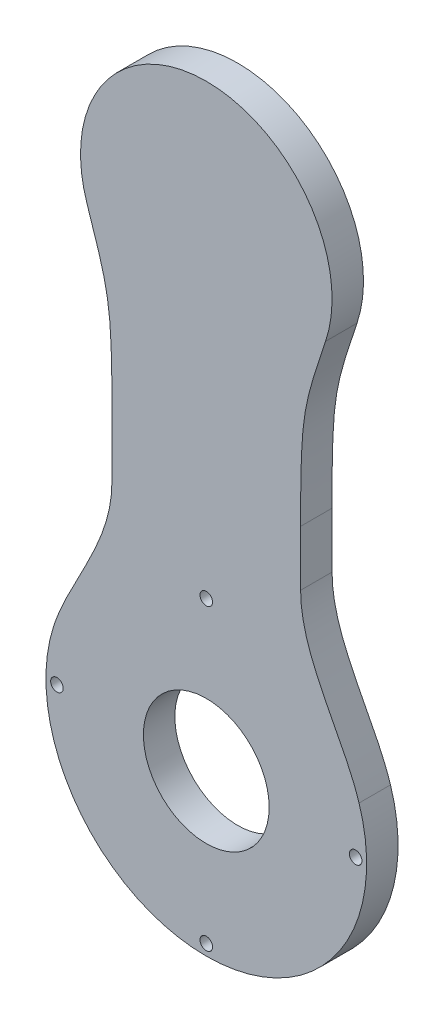
ISO-10303-21;
HEADER;
FILE_DESCRIPTION(('STEP AP214'),'2;1');
FILE_NAME('part.step','',(''),(''),'','','');
FILE_SCHEMA(('AUTOMOTIVE_DESIGN { 1 0 10303 214 1 1 1 1 }'));
ENDSEC;
DATA;
#1=APPLICATION_CONTEXT('core data for automotive mechanical design processes');
#2=APPLICATION_PROTOCOL_DEFINITION('international standard','automotive_design',2000,#1);
#3=PRODUCT_CONTEXT('',#1,'mechanical');
#4=PRODUCT('Part','Part','',(#3));
#5=PRODUCT_RELATED_PRODUCT_CATEGORY('part','',(#4));
#6=PRODUCT_DEFINITION_FORMATION('','',#4);
#7=PRODUCT_DEFINITION_CONTEXT('part definition',#1,'design');
#8=PRODUCT_DEFINITION('design','',#6,#7);
#9=PRODUCT_DEFINITION_SHAPE('','',#8);
#10=(LENGTH_UNIT() NAMED_UNIT(*) SI_UNIT(.MILLI.,.METRE.));
#11=(NAMED_UNIT(*) PLANE_ANGLE_UNIT() SI_UNIT($,.RADIAN.));
#12=(NAMED_UNIT(*) SI_UNIT($,.STERADIAN.) SOLID_ANGLE_UNIT());
#13=UNCERTAINTY_MEASURE_WITH_UNIT(LENGTH_MEASURE(1.E-05),#10,'distance_accuracy_value','');
#14=(GEOMETRIC_REPRESENTATION_CONTEXT(3) GLOBAL_UNCERTAINTY_ASSIGNED_CONTEXT((#13)) GLOBAL_UNIT_ASSIGNED_CONTEXT((#10,
#11,#12)) REPRESENTATION_CONTEXT('',''));
#15=CARTESIAN_POINT('',(0.,0.,0.));
#16=DIRECTION('',(0.,0.,1.));
#17=DIRECTION('',(1.,0.,0.));
#18=AXIS2_PLACEMENT_3D('',#15,#16,#17);
#19=CARTESIAN_POINT('',(-30.,0.,10.));
#20=DIRECTION('',(-1.,0.,0.));
#21=DIRECTION('',(0.,0.,1.));
#22=AXIS2_PLACEMENT_3D('',#19,#20,#21);
#23=PLANE('',#22);
#24=DIRECTION('',(0.,1.,0.));
#25=VECTOR('',#24,1.);
#26=CARTESIAN_POINT('',(-30.,0.,0.));
#27=LINE('',#26,#25);
#28=CARTESIAN_POINT('',(-30.,64.7865727396653,0.));
#29=VERTEX_POINT('',#28);
#30=CARTESIAN_POINT('',(-30.,82.3928340719783,0.));
#31=VERTEX_POINT('',#30);
#32=EDGE_CURVE('E205',#29,#31,#27,.T.);
#33=ORIENTED_EDGE('',*,*,#32,.F.);
#34=DIRECTION('',(0.,0.,-1.));
#35=VECTOR('',#34,1.);
#36=CARTESIAN_POINT('',(-30.,64.7865727396653,10.));
#37=LINE('',#36,#35);
#38=CARTESIAN_POINT('',(-30.,64.7865727396653,10.));
#39=VERTEX_POINT('',#38);
#40=EDGE_CURVE('E11',#39,#29,#37,.T.);
#41=ORIENTED_EDGE('',*,*,#40,.F.);
#42=DIRECTION('',(0.,1.,0.));
#43=VECTOR('',#42,1.);
#44=CARTESIAN_POINT('',(-30.,0.,10.));
#45=LINE('',#44,#43);
#46=CARTESIAN_POINT('',(-30.,82.3928340719783,10.));
#47=VERTEX_POINT('',#46);
#48=EDGE_CURVE('E183',#39,#47,#45,.T.);
#49=ORIENTED_EDGE('',*,*,#48,.T.);
#50=DIRECTION('',(0.,0.,-1.));
#51=VECTOR('',#50,1.);
#52=CARTESIAN_POINT('',(-30.,82.3928340719783,10.));
#53=LINE('',#52,#51);
#54=EDGE_CURVE('E96',#47,#31,#53,.T.);
#55=ORIENTED_EDGE('',*,*,#54,.T.);
#56=EDGE_LOOP('',(#33,#41,#49,#55));
#57=FACE_BOUND('',#56,.T.);
#58=ADVANCED_FACE('F45',(#57),#23,.T.);
#59=CARTESIAN_POINT('',(-30.,64.7865727396653,10.));
#60=CARTESIAN_POINT('',(-30.,46.7343602322097,10.));
#61=CARTESIAN_POINT('',(-43.4581047980647,31.6007928073329,10.));
#62=CARTESIAN_POINT('',(-48.5935699785818,15.4811161334275,10.));
#63=B_SPLINE_CURVE_WITH_KNOTS('',3,(#59,#60,#61,#62),.UNSPECIFIED.,.F.,.F.,(4,4),(0.,1.),.UNSPECIFIED.);
#64=DIRECTION('',(0.,0.,-1.));
#65=VECTOR('',#64,1.);
#66=SURFACE_OF_LINEAR_EXTRUSION('',#63,#65);
#67=CARTESIAN_POINT('',(-30.,64.7865727396653,0.));
#68=CARTESIAN_POINT('',(-30.,46.7343602322097,0.));
#69=CARTESIAN_POINT('',(-43.4581047980647,31.6007928073329,0.));
#70=CARTESIAN_POINT('',(-48.5935699785818,15.4811161334275,0.));
#71=B_SPLINE_CURVE_WITH_KNOTS('',3,(#67,#68,#69,#70),.UNSPECIFIED.,.F.,.F.,(4,4),(0.,1.),.UNSPECIFIED.);
#72=CARTESIAN_POINT('',(-48.5935699785818,15.4811161334275,0.));
#73=VERTEX_POINT('',#72);
#74=EDGE_CURVE('E199',#29,#73,#71,.T.);
#75=ORIENTED_EDGE('',*,*,#74,.T.);
#76=DIRECTION('',(0.,0.,-1.));
#77=VECTOR('',#76,1.);
#78=CARTESIAN_POINT('',(-48.5935699785818,15.4811161334275,10.));
#79=LINE('',#78,#77);
#80=CARTESIAN_POINT('',(-48.5935699785818,15.4811161334275,10.));
#81=VERTEX_POINT('',#80);
#82=EDGE_CURVE('E54',#81,#73,#79,.T.);
#83=ORIENTED_EDGE('',*,*,#82,.F.);
#84=EDGE_CURVE('E177',#39,#81,#63,.T.);
#85=ORIENTED_EDGE('',*,*,#84,.F.);
#86=ORIENTED_EDGE('',*,*,#40,.T.);
#87=EDGE_LOOP('',(#75,#83,#85,#86));
#88=FACE_BOUND('',#87,.T.);
#89=ADVANCED_FACE('F188',(#88),#66,.F.);
#90=CARTESIAN_POINT('',(0.,0.,10.));
#91=DIRECTION('',(0.,0.,-1.));
#92=DIRECTION('',(-1.,0.,0.));
#93=AXIS2_PLACEMENT_3D('',#90,#91,#92);
#94=CYLINDRICAL_SURFACE('',#93,51.);
#95=CARTESIAN_POINT('',(0.,0.,0.));
#96=DIRECTION('',(0.,0.,1.));
#97=DIRECTION('',(1.,0.,0.));
#98=AXIS2_PLACEMENT_3D('',#95,#96,#97);
#99=CIRCLE('',#98,51.);
#100=CARTESIAN_POINT('',(48.5935699785818,15.4811161334275,0.));
#101=VERTEX_POINT('',#100);
#102=EDGE_CURVE('E204',#101,#73,#99,.F.);
#103=ORIENTED_EDGE('',*,*,#102,.F.);
#104=DIRECTION('',(0.,0.,-1.));
#105=VECTOR('',#104,1.);
#106=CARTESIAN_POINT('',(48.5935699785818,15.4811161334275,10.));
#107=LINE('',#106,#105);
#108=CARTESIAN_POINT('',(48.5935699785818,15.4811161334275,10.));
#109=VERTEX_POINT('',#108);
#110=EDGE_CURVE('E256',#109,#101,#107,.T.);
#111=ORIENTED_EDGE('',*,*,#110,.F.);
#112=CARTESIAN_POINT('',(0.,0.,10.));
#113=DIRECTION('',(0.,0.,1.));
#114=DIRECTION('',(1.,0.,0.));
#115=AXIS2_PLACEMENT_3D('',#112,#113,#114);
#116=CIRCLE('',#115,51.);
#117=EDGE_CURVE('E170',#109,#81,#116,.F.);
#118=ORIENTED_EDGE('',*,*,#117,.T.);
#119=ORIENTED_EDGE('',*,*,#82,.T.);
#120=EDGE_LOOP('',(#103,#111,#118,#119));
#121=FACE_BOUND('',#120,.T.);
#122=ADVANCED_FACE('F162',(#121),#94,.T.);
#123=CARTESIAN_POINT('',(30.,64.7865727396653,10.));
#124=CARTESIAN_POINT('',(30.,46.7343602322097,10.));
#125=CARTESIAN_POINT('',(43.4581047980647,31.6007928073329,10.));
#126=CARTESIAN_POINT('',(48.5935699785818,15.4811161334275,10.));
#127=B_SPLINE_CURVE_WITH_KNOTS('',3,(#123,#124,#125,#126),.UNSPECIFIED.,.F.,.F.,(4,4),(0.,1.),.UNSPECIFIED.);
#128=DIRECTION('',(0.,0.,-1.));
#129=VECTOR('',#128,1.);
#130=SURFACE_OF_LINEAR_EXTRUSION('',#127,#129);
#131=CARTESIAN_POINT('',(30.,64.7865727396653,0.));
#132=CARTESIAN_POINT('',(30.,46.7343602322097,0.));
#133=CARTESIAN_POINT('',(43.4581047980647,31.6007928073329,0.));
#134=CARTESIAN_POINT('',(48.5935699785818,15.4811161334275,0.));
#135=B_SPLINE_CURVE_WITH_KNOTS('',3,(#131,#132,#133,#134),.UNSPECIFIED.,.F.,.F.,(4,4),(0.,1.),.UNSPECIFIED.);
#136=CARTESIAN_POINT('',(30.,64.7865727396653,0.));
#137=VERTEX_POINT('',#136);
#138=EDGE_CURVE('E212',#137,#101,#135,.T.);
#139=ORIENTED_EDGE('',*,*,#138,.F.);
#140=DIRECTION('',(0.,0.,-1.));
#141=VECTOR('',#140,1.);
#142=CARTESIAN_POINT('',(30.,64.7865727396653,10.));
#143=LINE('',#142,#141);
#144=CARTESIAN_POINT('',(30.,64.7865727396653,10.));
#145=VERTEX_POINT('',#144);
#146=EDGE_CURVE('E253',#145,#137,#143,.T.);
#147=ORIENTED_EDGE('',*,*,#146,.F.);
#148=EDGE_CURVE('E140',#145,#109,#127,.T.);
#149=ORIENTED_EDGE('',*,*,#148,.T.);
#150=ORIENTED_EDGE('',*,*,#110,.T.);
#151=EDGE_LOOP('',(#139,#147,#149,#150));
#152=FACE_BOUND('',#151,.T.);
#153=ADVANCED_FACE('F158',(#152),#130,.T.);
#154=CARTESIAN_POINT('',(30.,0.,10.));
#155=DIRECTION('',(-1.,0.,0.));
#156=DIRECTION('',(0.,-1.,0.));
#157=AXIS2_PLACEMENT_3D('',#154,#155,#156);
#158=PLANE('',#157);
#159=DIRECTION('',(0.,1.,0.));
#160=VECTOR('',#159,1.);
#161=CARTESIAN_POINT('',(30.,0.,0.));
#162=LINE('',#161,#160);
#163=CARTESIAN_POINT('',(30.,82.3928340719783,0.));
#164=VERTEX_POINT('',#163);
#165=EDGE_CURVE('E216',#137,#164,#162,.T.);
#166=ORIENTED_EDGE('',*,*,#165,.T.);
#167=DIRECTION('',(0.,0.,-1.));
#168=VECTOR('',#167,1.);
#169=CARTESIAN_POINT('',(30.,82.3928340719783,10.));
#170=LINE('',#169,#168);
#171=CARTESIAN_POINT('',(30.,82.3928340719783,10.));
#172=VERTEX_POINT('',#171);
#173=EDGE_CURVE('E125',#172,#164,#170,.T.);
#174=ORIENTED_EDGE('',*,*,#173,.F.);
#175=DIRECTION('',(0.,1.,0.));
#176=VECTOR('',#175,1.);
#177=CARTESIAN_POINT('',(30.,0.,10.));
#178=LINE('',#177,#176);
#179=EDGE_CURVE('E135',#145,#172,#178,.T.);
#180=ORIENTED_EDGE('',*,*,#179,.F.);
#181=ORIENTED_EDGE('',*,*,#146,.T.);
#182=EDGE_LOOP('',(#166,#174,#180,#181));
#183=FACE_BOUND('',#182,.T.);
#184=ADVANCED_FACE('F154',(#183),#158,.F.);
#185=CARTESIAN_POINT('',(37.9326366545191,137.306888622712,10.));
#186=CARTESIAN_POINT('',(30.7363635945922,115.801238578756,10.));
#187=CARTESIAN_POINT('',(30.,113.598295334296,10.));
#188=CARTESIAN_POINT('',(30.,82.3928340719783,10.));
#189=B_SPLINE_CURVE_WITH_KNOTS('',3,(#185,#186,#187,#188),.UNSPECIFIED.,.F.,.F.,(4,4),(0.,1.),.UNSPECIFIED.);
#190=DIRECTION('',(0.,0.,-1.));
#191=VECTOR('',#190,1.);
#192=SURFACE_OF_LINEAR_EXTRUSION('',#189,#191);
#193=CARTESIAN_POINT('',(37.9326366545191,137.306888622712,0.));
#194=CARTESIAN_POINT('',(30.7363635945922,115.801238578756,0.));
#195=CARTESIAN_POINT('',(30.,113.598295334296,0.));
#196=CARTESIAN_POINT('',(30.,82.3928340719783,0.));
#197=B_SPLINE_CURVE_WITH_KNOTS('',3,(#193,#194,#195,#196),.UNSPECIFIED.,.F.,.F.,(4,4),(0.,1.),.UNSPECIFIED.);
#198=CARTESIAN_POINT('',(37.9326366545191,137.306888622712,0.));
#199=VERTEX_POINT('',#198);
#200=EDGE_CURVE('E123',#199,#164,#197,.T.);
#201=ORIENTED_EDGE('',*,*,#200,.F.);
#202=DIRECTION('',(0.,0.,-1.));
#203=VECTOR('',#202,1.);
#204=CARTESIAN_POINT('',(37.9326366545191,137.306888622712,10.));
#205=LINE('',#204,#203);
#206=CARTESIAN_POINT('',(37.9326366545191,137.306888622712,10.));
#207=VERTEX_POINT('',#206);
#208=EDGE_CURVE('E117',#207,#199,#205,.T.);
#209=ORIENTED_EDGE('',*,*,#208,.F.);
#210=EDGE_CURVE('E121',#207,#172,#189,.T.);
#211=ORIENTED_EDGE('',*,*,#210,.T.);
#212=ORIENTED_EDGE('',*,*,#173,.T.);
#213=EDGE_LOOP('',(#201,#209,#211,#212));
#214=FACE_BOUND('',#213,.T.);
#215=ADVANCED_FACE('F119',(#214),#192,.T.);
#216=CARTESIAN_POINT('',(0.,150.,10.));
#217=DIRECTION('',(0.,0.,-1.));
#218=DIRECTION('',(-1.,0.,0.));
#219=AXIS2_PLACEMENT_3D('',#216,#217,#218);
#220=CYLINDRICAL_SURFACE('',#219,40.);
#221=CARTESIAN_POINT('',(0.,150.,0.));
#222=DIRECTION('',(0.,0.,1.));
#223=DIRECTION('',(1.,0.,0.));
#224=AXIS2_PLACEMENT_3D('',#221,#222,#223);
#225=CIRCLE('',#224,40.);
#226=CARTESIAN_POINT('',(-37.9326366545191,137.306888622712,0.));
#227=VERTEX_POINT('',#226);
#228=EDGE_CURVE('E89',#199,#227,#225,.T.);
#229=ORIENTED_EDGE('',*,*,#228,.T.);
#230=DIRECTION('',(0.,0.,-1.));
#231=VECTOR('',#230,1.);
#232=CARTESIAN_POINT('',(-37.9326366545191,137.306888622712,10.));
#233=LINE('',#232,#231);
#234=CARTESIAN_POINT('',(-37.9326366545191,137.306888622712,10.));
#235=VERTEX_POINT('',#234);
#236=EDGE_CURVE('E126',#235,#227,#233,.T.);
#237=ORIENTED_EDGE('',*,*,#236,.F.);
#238=CARTESIAN_POINT('',(0.,150.,10.));
#239=DIRECTION('',(0.,0.,1.));
#240=DIRECTION('',(1.,0.,0.));
#241=AXIS2_PLACEMENT_3D('',#238,#239,#240);
#242=CIRCLE('',#241,40.);
#243=EDGE_CURVE('E128',#207,#235,#242,.T.);
#244=ORIENTED_EDGE('',*,*,#243,.F.);
#245=ORIENTED_EDGE('',*,*,#208,.T.);
#246=EDGE_LOOP('',(#229,#237,#244,#245));
#247=FACE_BOUND('',#246,.T.);
#248=ADVANCED_FACE('F129',(#247),#220,.T.);
#249=CARTESIAN_POINT('',(-37.9326366545191,137.306888622712,10.));
#250=CARTESIAN_POINT('',(-30.7363635945922,115.801238578756,10.));
#251=CARTESIAN_POINT('',(-30.,113.598295334296,10.));
#252=CARTESIAN_POINT('',(-30.,82.3928340719783,10.));
#253=B_SPLINE_CURVE_WITH_KNOTS('',3,(#249,#250,#251,#252),.UNSPECIFIED.,.F.,.F.,(4,4),(0.,1.),.UNSPECIFIED.);
#254=DIRECTION('',(0.,0.,-1.));
#255=VECTOR('',#254,1.);
#256=SURFACE_OF_LINEAR_EXTRUSION('',#253,#255);
#257=CARTESIAN_POINT('',(-37.9326366545191,137.306888622712,0.));
#258=CARTESIAN_POINT('',(-30.7363635945922,115.801238578756,0.));
#259=CARTESIAN_POINT('',(-30.,113.598295334296,0.));
#260=CARTESIAN_POINT('',(-30.,82.3928340719783,0.));
#261=B_SPLINE_CURVE_WITH_KNOTS('',3,(#257,#258,#259,#260),.UNSPECIFIED.,.F.,.F.,(4,4),(0.,1.),.UNSPECIFIED.);
#262=EDGE_CURVE('E239',#227,#31,#261,.T.);
#263=ORIENTED_EDGE('',*,*,#262,.T.);
#264=ORIENTED_EDGE('',*,*,#54,.F.);
#265=EDGE_CURVE('E62',#235,#47,#253,.T.);
#266=ORIENTED_EDGE('',*,*,#265,.F.);
#267=ORIENTED_EDGE('',*,*,#236,.T.);
#268=EDGE_LOOP('',(#263,#264,#266,#267));
#269=FACE_BOUND('',#268,.T.);
#270=ADVANCED_FACE('F262',(#269),#256,.F.);
#271=CARTESIAN_POINT('',(0.,0.,10.));
#272=DIRECTION('',(0.,0.,1.));
#273=DIRECTION('',(1.,0.,0.));
#274=AXIS2_PLACEMENT_3D('',#271,#272,#273);
#275=PLANE('',#274);
#276=CARTESIAN_POINT('',(0.,-47.5,10.));
#277=DIRECTION('',(0.,0.,1.));
#278=DIRECTION('',(1.,0.,0.));
#279=AXIS2_PLACEMENT_3D('',#276,#277,#278);
#280=CIRCLE('',#279,2.);
#281=CARTESIAN_POINT('',(2.,-47.5,9.99999999999999));
#282=VERTEX_POINT('',#281);
#283=EDGE_CURVE('E305',#282,#282,#280,.T.);
#284=ORIENTED_EDGE('',*,*,#283,.F.);
#285=EDGE_LOOP('',(#284));
#286=FACE_BOUND('',#285,.T.);
#287=CARTESIAN_POINT('',(47.5,-5.16456276537103E-13,10.));
#288=DIRECTION('',(0.,0.,1.));
#289=DIRECTION('',(1.,0.,0.));
#290=AXIS2_PLACEMENT_3D('',#287,#288,#289);
#291=CIRCLE('',#290,2.);
#292=CARTESIAN_POINT('',(49.5,-5.16456276537103E-13,9.99999999999999));
#293=VERTEX_POINT('',#292);
#294=EDGE_CURVE('E321',#293,#293,#291,.T.);
#295=ORIENTED_EDGE('',*,*,#294,.F.);
#296=EDGE_LOOP('',(#295));
#297=FACE_BOUND('',#296,.T.);
#298=CARTESIAN_POINT('',(1.00267016911459E-12,47.5,10.));
#299=DIRECTION('',(0.,0.,1.));
#300=DIRECTION('',(1.,0.,0.));
#301=AXIS2_PLACEMENT_3D('',#298,#299,#300);
#302=CIRCLE('',#301,2.);
#303=CARTESIAN_POINT('',(2.00000000000101,47.5,9.99999999999999));
#304=VERTEX_POINT('',#303);
#305=EDGE_CURVE('E320',#304,#304,#302,.T.);
#306=ORIENTED_EDGE('',*,*,#305,.F.);
#307=EDGE_LOOP('',(#306));
#308=FACE_BOUND('',#307,.T.);
#309=CARTESIAN_POINT('',(-47.5,0.,10.));
#310=DIRECTION('',(0.,0.,1.));
#311=DIRECTION('',(1.,0.,0.));
#312=AXIS2_PLACEMENT_3D('',#309,#310,#311);
#313=CIRCLE('',#312,1.99999999999845);
#314=CARTESIAN_POINT('',(-45.5000000000016,0.,9.99999999999999));
#315=VERTEX_POINT('',#314);
#316=EDGE_CURVE('E335',#315,#315,#313,.T.);
#317=ORIENTED_EDGE('',*,*,#316,.F.);
#318=EDGE_LOOP('',(#317));
#319=FACE_BOUND('',#318,.T.);
#320=CARTESIAN_POINT('',(0.,0.,10.));
#321=DIRECTION('',(0.,0.,1.));
#322=DIRECTION('',(1.,0.,0.));
#323=AXIS2_PLACEMENT_3D('',#320,#321,#322);
#324=CIRCLE('',#323,20.);
#325=CARTESIAN_POINT('',(20.,0.,9.99999999999999));
#326=VERTEX_POINT('',#325);
#327=EDGE_CURVE('E307',#326,#326,#324,.T.);
#328=ORIENTED_EDGE('',*,*,#327,.F.);
#329=EDGE_LOOP('',(#328));
#330=FACE_BOUND('',#329,.T.);
#331=ORIENTED_EDGE('',*,*,#48,.F.);
#332=ORIENTED_EDGE('',*,*,#84,.T.);
#333=ORIENTED_EDGE('',*,*,#117,.F.);
#334=ORIENTED_EDGE('',*,*,#148,.F.);
#335=ORIENTED_EDGE('',*,*,#179,.T.);
#336=ORIENTED_EDGE('',*,*,#210,.F.);
#337=ORIENTED_EDGE('',*,*,#243,.T.);
#338=ORIENTED_EDGE('',*,*,#265,.T.);
#339=EDGE_LOOP('',(#331,#332,#333,#334,#335,#336,#337,#338));
#340=FACE_BOUND('',#339,.T.);
#341=ADVANCED_FACE('F132',(#286,#297,#308,#319,#330,#340),#275,.T.);
#342=CARTESIAN_POINT('',(0.,0.,0.));
#343=DIRECTION('',(0.,0.,1.));
#344=DIRECTION('',(1.,0.,0.));
#345=AXIS2_PLACEMENT_3D('',#342,#343,#344);
#346=PLANE('',#345);
#347=CARTESIAN_POINT('',(0.,-47.5,0.));
#348=DIRECTION('',(0.,0.,1.));
#349=DIRECTION('',(1.,0.,0.));
#350=AXIS2_PLACEMENT_3D('',#347,#348,#349);
#351=CIRCLE('',#350,2.);
#352=CARTESIAN_POINT('',(2.,-47.5,0.));
#353=VERTEX_POINT('',#352);
#354=EDGE_CURVE('E302',#353,#353,#351,.F.);
#355=ORIENTED_EDGE('',*,*,#354,.F.);
#356=EDGE_LOOP('',(#355));
#357=FACE_BOUND('',#356,.T.);
#358=CARTESIAN_POINT('',(47.5,-5.16456276537103E-13,0.));
#359=DIRECTION('',(0.,0.,1.));
#360=DIRECTION('',(1.,0.,0.));
#361=AXIS2_PLACEMENT_3D('',#358,#359,#360);
#362=CIRCLE('',#361,2.);
#363=CARTESIAN_POINT('',(49.5,-5.16456276537103E-13,0.));
#364=VERTEX_POINT('',#363);
#365=EDGE_CURVE('E326',#364,#364,#362,.F.);
#366=ORIENTED_EDGE('',*,*,#365,.F.);
#367=EDGE_LOOP('',(#366));
#368=FACE_BOUND('',#367,.T.);
#369=CARTESIAN_POINT('',(1.00267016911459E-12,47.5,0.));
#370=DIRECTION('',(0.,0.,1.));
#371=DIRECTION('',(1.,0.,0.));
#372=AXIS2_PLACEMENT_3D('',#369,#370,#371);
#373=CIRCLE('',#372,2.);
#374=CARTESIAN_POINT('',(2.00000000000101,47.5,0.));
#375=VERTEX_POINT('',#374);
#376=EDGE_CURVE('E316',#375,#375,#373,.F.);
#377=ORIENTED_EDGE('',*,*,#376,.F.);
#378=EDGE_LOOP('',(#377));
#379=FACE_BOUND('',#378,.T.);
#380=CARTESIAN_POINT('',(-47.5,0.,0.));
#381=DIRECTION('',(0.,0.,1.));
#382=DIRECTION('',(1.,0.,0.));
#383=AXIS2_PLACEMENT_3D('',#380,#381,#382);
#384=CIRCLE('',#383,1.99999999999845);
#385=CARTESIAN_POINT('',(-45.5000000000016,0.,0.));
#386=VERTEX_POINT('',#385);
#387=EDGE_CURVE('E325',#386,#386,#384,.F.);
#388=ORIENTED_EDGE('',*,*,#387,.F.);
#389=EDGE_LOOP('',(#388));
#390=FACE_BOUND('',#389,.T.);
#391=CARTESIAN_POINT('',(0.,0.,0.));
#392=DIRECTION('',(0.,0.,1.));
#393=DIRECTION('',(1.,0.,0.));
#394=AXIS2_PLACEMENT_3D('',#391,#392,#393);
#395=CIRCLE('',#394,20.);
#396=CARTESIAN_POINT('',(20.,0.,0.));
#397=VERTEX_POINT('',#396);
#398=EDGE_CURVE('E313',#397,#397,#395,.F.);
#399=ORIENTED_EDGE('',*,*,#398,.F.);
#400=EDGE_LOOP('',(#399));
#401=FACE_BOUND('',#400,.T.);
#402=ORIENTED_EDGE('',*,*,#32,.T.);
#403=ORIENTED_EDGE('',*,*,#262,.F.);
#404=ORIENTED_EDGE('',*,*,#228,.F.);
#405=ORIENTED_EDGE('',*,*,#200,.T.);
#406=ORIENTED_EDGE('',*,*,#165,.F.);
#407=ORIENTED_EDGE('',*,*,#138,.T.);
#408=ORIENTED_EDGE('',*,*,#102,.T.);
#409=ORIENTED_EDGE('',*,*,#74,.F.);
#410=EDGE_LOOP('',(#402,#403,#404,#405,#406,#407,#408,#409));
#411=FACE_BOUND('',#410,.T.);
#412=ADVANCED_FACE('F209',(#357,#368,#379,#390,#401,#411),#346,.F.);
#413=CARTESIAN_POINT('',(0.,0.,-56.5685424949238));
#414=DIRECTION('',(0.,0.,1.));
#415=DIRECTION('',(1.,0.,0.));
#416=AXIS2_PLACEMENT_3D('',#413,#414,#415);
#417=CYLINDRICAL_SURFACE('',#416,20.);
#418=CARTESIAN_POINT('',(20.,0.,0.));
#419=CARTESIAN_POINT('',(20.,0.,0.104166666666667));
#420=CARTESIAN_POINT('',(20.,0.,0.208333333333334));
#421=CARTESIAN_POINT('',(20.,0.,0.416666666666667));
#422=CARTESIAN_POINT('',(20.,0.,0.520833333333334));
#423=CARTESIAN_POINT('',(20.,0.,0.729166666666667));
#424=CARTESIAN_POINT('',(20.,0.,0.833333333333334));
#425=CARTESIAN_POINT('',(20.,0.,1.04166666666667));
#426=CARTESIAN_POINT('',(20.,0.,1.14583333333333));
#427=CARTESIAN_POINT('',(20.,0.,1.35416666666667));
#428=CARTESIAN_POINT('',(20.,0.,1.45833333333333));
#429=CARTESIAN_POINT('',(20.,0.,1.66666666666667));
#430=CARTESIAN_POINT('',(20.,0.,1.77083333333334));
#431=CARTESIAN_POINT('',(20.,0.,1.97916666666667));
#432=CARTESIAN_POINT('',(20.,0.,2.08333333333334));
#433=CARTESIAN_POINT('',(20.,0.,2.29166666666667));
#434=CARTESIAN_POINT('',(20.,0.,2.39583333333334));
#435=CARTESIAN_POINT('',(20.,0.,2.60416666666667));
#436=CARTESIAN_POINT('',(20.,0.,2.70833333333333));
#437=CARTESIAN_POINT('',(20.,0.,2.91666666666666));
#438=CARTESIAN_POINT('',(20.,0.,3.02083333333333));
#439=CARTESIAN_POINT('',(20.,0.,3.22916666666666));
#440=CARTESIAN_POINT('',(20.,0.,3.33333333333333));
#441=CARTESIAN_POINT('',(20.,0.,3.54166666666666));
#442=CARTESIAN_POINT('',(20.,0.,3.64583333333333));
#443=CARTESIAN_POINT('',(20.,0.,3.85416666666666));
#444=CARTESIAN_POINT('',(20.,0.,3.95833333333333));
#445=CARTESIAN_POINT('',(20.,0.,4.16666666666666));
#446=CARTESIAN_POINT('',(20.,0.,4.27083333333333));
#447=CARTESIAN_POINT('',(20.,0.,4.47916666666666));
#448=CARTESIAN_POINT('',(20.,0.,4.58333333333333));
#449=CARTESIAN_POINT('',(20.,0.,4.79166666666666));
#450=CARTESIAN_POINT('',(20.,0.,4.89583333333333));
#451=CARTESIAN_POINT('',(20.,0.,5.10416666666666));
#452=CARTESIAN_POINT('',(20.,0.,5.20833333333333));
#453=CARTESIAN_POINT('',(20.,0.,5.41666666666666));
#454=CARTESIAN_POINT('',(20.,0.,5.52083333333333));
#455=CARTESIAN_POINT('',(20.,0.,5.72916666666666));
#456=CARTESIAN_POINT('',(20.,0.,5.83333333333333));
#457=CARTESIAN_POINT('',(20.,0.,6.04166666666666));
#458=CARTESIAN_POINT('',(20.,0.,6.14583333333332));
#459=CARTESIAN_POINT('',(20.,0.,6.35416666666665));
#460=CARTESIAN_POINT('',(20.,0.,6.45833333333332));
#461=CARTESIAN_POINT('',(20.,0.,6.66666666666666));
#462=CARTESIAN_POINT('',(20.,0.,6.77083333333332));
#463=CARTESIAN_POINT('',(20.,0.,6.97916666666665));
#464=CARTESIAN_POINT('',(20.,0.,7.08333333333332));
#465=CARTESIAN_POINT('',(20.,0.,7.29166666666666));
#466=CARTESIAN_POINT('',(20.,0.,7.39583333333332));
#467=CARTESIAN_POINT('',(20.,0.,7.60416666666665));
#468=CARTESIAN_POINT('',(20.,0.,7.70833333333332));
#469=CARTESIAN_POINT('',(20.,0.,7.91666666666666));
#470=CARTESIAN_POINT('',(20.,0.,8.02083333333332));
#471=CARTESIAN_POINT('',(20.,0.,8.22916666666666));
#472=CARTESIAN_POINT('',(20.,0.,8.33333333333333));
#473=CARTESIAN_POINT('',(20.,0.,8.54166666666666));
#474=CARTESIAN_POINT('',(20.,0.,8.64583333333332));
#475=CARTESIAN_POINT('',(20.,0.,8.85416666666666));
#476=CARTESIAN_POINT('',(20.,0.,8.95833333333333));
#477=CARTESIAN_POINT('',(20.,0.,9.16666666666666));
#478=CARTESIAN_POINT('',(20.,0.,9.27083333333332));
#479=CARTESIAN_POINT('',(20.,0.,9.47916666666666));
#480=CARTESIAN_POINT('',(20.,0.,9.58333333333333));
#481=CARTESIAN_POINT('',(20.,0.,9.79166666666666));
#482=CARTESIAN_POINT('',(20.,0.,9.89583333333333));
#483=CARTESIAN_POINT('',(20.,0.,9.99999999999999));
#484=B_SPLINE_CURVE_WITH_KNOTS('',3,(#418,#419,#420,#421,#422,#423,#424,#425,#426,#427,#428,
#429,#430,#431,#432,#433,#434,#435,#436,#437,#438,#439,#440,#441,#442,#443,#444,#445,#446,#447,
#448,#449,#450,#451,#452,#453,#454,#455,#456,#457,#458,#459,#460,#461,#462,#463,#464,#465,#466,
#467,#468,#469,#470,#471,#472,#473,#474,#475,#476,#477,#478,#479,#480,#481,#482,#483),
.UNSPECIFIED.,.F.,.F.,(4,2,2,2,2,2,2,2,2,2,2,2,2,2,2,2,2,2,2,2,2,2,2,2,2,2,2,2,2,2,2,2,4),(0.,
0.3125,0.625000000000001,0.937500000000001,1.25,1.5625,1.875,2.1875,2.5,2.8125,3.125,3.4375,
3.75,4.0625,4.375,4.6875,5.,5.3125,5.625,5.93749999999999,6.24999999999998,6.56249999999999,
6.87499999999998,7.18749999999999,7.49999999999999,7.81249999999999,8.12499999999999,
8.43749999999999,8.74999999999999,9.06249999999999,9.37499999999999,9.68749999999999,
9.99999999999999),.UNSPECIFIED.);
#485=EDGE_CURVE('BSEAM274',#397,#326,#484,.T.);
#486=ORIENTED_EDGE('',*,*,#398,.T.);
#487=ORIENTED_EDGE('',*,*,#327,.T.);
#488=ORIENTED_EDGE('',*,*,#485,.T.);
#489=ORIENTED_EDGE('',*,*,#485,.F.);
#490=EDGE_LOOP('',(#486,#488,#487,#489));
#491=FACE_BOUND('',#490,.T.);
#492=ADVANCED_FACE('F274',(#491),#417,.F.);
#493=CARTESIAN_POINT('',(-47.5,0.,-56.5685424949238));
#494=DIRECTION('',(0.,0.,1.));
#495=DIRECTION('',(1.,0.,0.));
#496=AXIS2_PLACEMENT_3D('',#493,#494,#495);
#497=CYLINDRICAL_SURFACE('',#496,1.99999999999845);
#498=CARTESIAN_POINT('',(-45.5000000000016,0.,0.));
#499=CARTESIAN_POINT('',(-45.5000000000016,0.,0.104166666666667));
#500=CARTESIAN_POINT('',(-45.5000000000016,0.,0.208333333333334));
#501=CARTESIAN_POINT('',(-45.5000000000016,0.,0.416666666666667));
#502=CARTESIAN_POINT('',(-45.5000000000016,0.,0.520833333333334));
#503=CARTESIAN_POINT('',(-45.5000000000016,0.,0.729166666666667));
#504=CARTESIAN_POINT('',(-45.5000000000016,0.,0.833333333333334));
#505=CARTESIAN_POINT('',(-45.5000000000016,0.,1.04166666666667));
#506=CARTESIAN_POINT('',(-45.5000000000016,0.,1.14583333333333));
#507=CARTESIAN_POINT('',(-45.5000000000016,0.,1.35416666666667));
#508=CARTESIAN_POINT('',(-45.5000000000016,0.,1.45833333333333));
#509=CARTESIAN_POINT('',(-45.5000000000016,0.,1.66666666666667));
#510=CARTESIAN_POINT('',(-45.5000000000016,0.,1.77083333333334));
#511=CARTESIAN_POINT('',(-45.5000000000016,0.,1.97916666666667));
#512=CARTESIAN_POINT('',(-45.5000000000016,0.,2.08333333333334));
#513=CARTESIAN_POINT('',(-45.5000000000016,0.,2.29166666666667));
#514=CARTESIAN_POINT('',(-45.5000000000016,0.,2.39583333333334));
#515=CARTESIAN_POINT('',(-45.5000000000016,0.,2.60416666666667));
#516=CARTESIAN_POINT('',(-45.5000000000016,0.,2.70833333333333));
#517=CARTESIAN_POINT('',(-45.5000000000016,0.,2.91666666666666));
#518=CARTESIAN_POINT('',(-45.5000000000016,0.,3.02083333333333));
#519=CARTESIAN_POINT('',(-45.5000000000016,0.,3.22916666666666));
#520=CARTESIAN_POINT('',(-45.5000000000016,0.,3.33333333333333));
#521=CARTESIAN_POINT('',(-45.5000000000016,0.,3.54166666666666));
#522=CARTESIAN_POINT('',(-45.5000000000016,0.,3.64583333333333));
#523=CARTESIAN_POINT('',(-45.5000000000016,0.,3.85416666666666));
#524=CARTESIAN_POINT('',(-45.5000000000016,0.,3.95833333333333));
#525=CARTESIAN_POINT('',(-45.5000000000016,0.,4.16666666666666));
#526=CARTESIAN_POINT('',(-45.5000000000016,0.,4.27083333333333));
#527=CARTESIAN_POINT('',(-45.5000000000016,0.,4.47916666666666));
#528=CARTESIAN_POINT('',(-45.5000000000016,0.,4.58333333333333));
#529=CARTESIAN_POINT('',(-45.5000000000016,0.,4.79166666666666));
#530=CARTESIAN_POINT('',(-45.5000000000016,0.,4.89583333333333));
#531=CARTESIAN_POINT('',(-45.5000000000016,0.,5.10416666666666));
#532=CARTESIAN_POINT('',(-45.5000000000016,0.,5.20833333333333));
#533=CARTESIAN_POINT('',(-45.5000000000016,0.,5.41666666666666));
#534=CARTESIAN_POINT('',(-45.5000000000016,0.,5.52083333333333));
#535=CARTESIAN_POINT('',(-45.5000000000016,0.,5.72916666666666));
#536=CARTESIAN_POINT('',(-45.5000000000016,0.,5.83333333333333));
#537=CARTESIAN_POINT('',(-45.5000000000016,0.,6.04166666666666));
#538=CARTESIAN_POINT('',(-45.5000000000016,0.,6.14583333333332));
#539=CARTESIAN_POINT('',(-45.5000000000016,0.,6.35416666666665));
#540=CARTESIAN_POINT('',(-45.5000000000016,0.,6.45833333333332));
#541=CARTESIAN_POINT('',(-45.5000000000016,0.,6.66666666666666));
#542=CARTESIAN_POINT('',(-45.5000000000016,0.,6.77083333333332));
#543=CARTESIAN_POINT('',(-45.5000000000016,0.,6.97916666666665));
#544=CARTESIAN_POINT('',(-45.5000000000016,0.,7.08333333333332));
#545=CARTESIAN_POINT('',(-45.5000000000016,0.,7.29166666666666));
#546=CARTESIAN_POINT('',(-45.5000000000016,0.,7.39583333333332));
#547=CARTESIAN_POINT('',(-45.5000000000016,0.,7.60416666666665));
#548=CARTESIAN_POINT('',(-45.5000000000016,0.,7.70833333333332));
#549=CARTESIAN_POINT('',(-45.5000000000016,0.,7.91666666666666));
#550=CARTESIAN_POINT('',(-45.5000000000016,0.,8.02083333333332));
#551=CARTESIAN_POINT('',(-45.5000000000016,0.,8.22916666666666));
#552=CARTESIAN_POINT('',(-45.5000000000016,0.,8.33333333333333));
#553=CARTESIAN_POINT('',(-45.5000000000016,0.,8.54166666666666));
#554=CARTESIAN_POINT('',(-45.5000000000016,0.,8.64583333333332));
#555=CARTESIAN_POINT('',(-45.5000000000016,0.,8.85416666666666));
#556=CARTESIAN_POINT('',(-45.5000000000016,0.,8.95833333333333));
#557=CARTESIAN_POINT('',(-45.5000000000016,0.,9.16666666666666));
#558=CARTESIAN_POINT('',(-45.5000000000016,0.,9.27083333333332));
#559=CARTESIAN_POINT('',(-45.5000000000016,0.,9.47916666666666));
#560=CARTESIAN_POINT('',(-45.5000000000016,0.,9.58333333333333));
#561=CARTESIAN_POINT('',(-45.5000000000016,0.,9.79166666666666));
#562=CARTESIAN_POINT('',(-45.5000000000016,0.,9.89583333333333));
#563=CARTESIAN_POINT('',(-45.5000000000016,0.,9.99999999999999));
#564=B_SPLINE_CURVE_WITH_KNOTS('',3,(#498,#499,#500,#501,#502,#503,#504,#505,#506,#507,#508,
#509,#510,#511,#512,#513,#514,#515,#516,#517,#518,#519,#520,#521,#522,#523,#524,#525,#526,#527,
#528,#529,#530,#531,#532,#533,#534,#535,#536,#537,#538,#539,#540,#541,#542,#543,#544,#545,#546,
#547,#548,#549,#550,#551,#552,#553,#554,#555,#556,#557,#558,#559,#560,#561,#562,#563),
.UNSPECIFIED.,.F.,.F.,(4,2,2,2,2,2,2,2,2,2,2,2,2,2,2,2,2,2,2,2,2,2,2,2,2,2,2,2,2,2,2,2,4),(0.,
0.3125,0.625000000000001,0.937500000000001,1.25,1.5625,1.875,2.1875,2.5,2.8125,3.125,3.4375,
3.75,4.0625,4.375,4.6875,5.,5.3125,5.625,5.93749999999999,6.24999999999998,6.56249999999999,
6.87499999999998,7.18749999999999,7.49999999999999,7.81249999999999,8.12499999999999,
8.43749999999999,8.74999999999999,9.06249999999999,9.37499999999999,9.68749999999999,
9.99999999999999),.UNSPECIFIED.);
#565=EDGE_CURVE('BSEAM279',#386,#315,#564,.T.);
#566=ORIENTED_EDGE('',*,*,#387,.T.);
#567=ORIENTED_EDGE('',*,*,#316,.T.);
#568=ORIENTED_EDGE('',*,*,#565,.T.);
#569=ORIENTED_EDGE('',*,*,#565,.F.);
#570=EDGE_LOOP('',(#566,#568,#567,#569));
#571=FACE_BOUND('',#570,.T.);
#572=ADVANCED_FACE('F279',(#571),#497,.F.);
#573=CARTESIAN_POINT('',(1.00267016911459E-12,47.5,-56.5685424949238));
#574=DIRECTION('',(0.,0.,1.));
#575=DIRECTION('',(1.,0.,0.));
#576=AXIS2_PLACEMENT_3D('',#573,#574,#575);
#577=CYLINDRICAL_SURFACE('',#576,2.);
#578=CARTESIAN_POINT('',(2.00000000000101,47.5,0.));
#579=CARTESIAN_POINT('',(2.00000000000101,47.5,0.104166666666667));
#580=CARTESIAN_POINT('',(2.00000000000101,47.5,0.208333333333334));
#581=CARTESIAN_POINT('',(2.00000000000101,47.5,0.416666666666667));
#582=CARTESIAN_POINT('',(2.00000000000101,47.5,0.520833333333334));
#583=CARTESIAN_POINT('',(2.00000000000101,47.5,0.729166666666667));
#584=CARTESIAN_POINT('',(2.00000000000101,47.5,0.833333333333334));
#585=CARTESIAN_POINT('',(2.00000000000101,47.5,1.04166666666667));
#586=CARTESIAN_POINT('',(2.00000000000101,47.5,1.14583333333333));
#587=CARTESIAN_POINT('',(2.00000000000101,47.5,1.35416666666667));
#588=CARTESIAN_POINT('',(2.00000000000101,47.5,1.45833333333333));
#589=CARTESIAN_POINT('',(2.00000000000101,47.5,1.66666666666667));
#590=CARTESIAN_POINT('',(2.00000000000101,47.5,1.77083333333334));
#591=CARTESIAN_POINT('',(2.00000000000101,47.5,1.97916666666667));
#592=CARTESIAN_POINT('',(2.00000000000101,47.5,2.08333333333334));
#593=CARTESIAN_POINT('',(2.00000000000101,47.5,2.29166666666667));
#594=CARTESIAN_POINT('',(2.00000000000101,47.5,2.39583333333334));
#595=CARTESIAN_POINT('',(2.00000000000101,47.5,2.60416666666667));
#596=CARTESIAN_POINT('',(2.00000000000101,47.5,2.70833333333333));
#597=CARTESIAN_POINT('',(2.00000000000101,47.5,2.91666666666666));
#598=CARTESIAN_POINT('',(2.00000000000101,47.5,3.02083333333333));
#599=CARTESIAN_POINT('',(2.00000000000101,47.5,3.22916666666666));
#600=CARTESIAN_POINT('',(2.00000000000101,47.5,3.33333333333333));
#601=CARTESIAN_POINT('',(2.00000000000101,47.5,3.54166666666666));
#602=CARTESIAN_POINT('',(2.00000000000101,47.5,3.64583333333333));
#603=CARTESIAN_POINT('',(2.00000000000101,47.5,3.85416666666666));
#604=CARTESIAN_POINT('',(2.00000000000101,47.5,3.95833333333333));
#605=CARTESIAN_POINT('',(2.00000000000101,47.5,4.16666666666666));
#606=CARTESIAN_POINT('',(2.00000000000101,47.5,4.27083333333333));
#607=CARTESIAN_POINT('',(2.00000000000101,47.5,4.47916666666666));
#608=CARTESIAN_POINT('',(2.00000000000101,47.5,4.58333333333333));
#609=CARTESIAN_POINT('',(2.00000000000101,47.5,4.79166666666666));
#610=CARTESIAN_POINT('',(2.00000000000101,47.5,4.89583333333333));
#611=CARTESIAN_POINT('',(2.00000000000101,47.5,5.10416666666666));
#612=CARTESIAN_POINT('',(2.00000000000101,47.5,5.20833333333333));
#613=CARTESIAN_POINT('',(2.00000000000101,47.5,5.41666666666666));
#614=CARTESIAN_POINT('',(2.00000000000101,47.5,5.52083333333333));
#615=CARTESIAN_POINT('',(2.00000000000101,47.5,5.72916666666666));
#616=CARTESIAN_POINT('',(2.00000000000101,47.5,5.83333333333333));
#617=CARTESIAN_POINT('',(2.00000000000101,47.5,6.04166666666666));
#618=CARTESIAN_POINT('',(2.00000000000101,47.5,6.14583333333332));
#619=CARTESIAN_POINT('',(2.00000000000101,47.5,6.35416666666665));
#620=CARTESIAN_POINT('',(2.00000000000101,47.5,6.45833333333332));
#621=CARTESIAN_POINT('',(2.00000000000101,47.5,6.66666666666666));
#622=CARTESIAN_POINT('',(2.00000000000101,47.5,6.77083333333332));
#623=CARTESIAN_POINT('',(2.00000000000101,47.5,6.97916666666665));
#624=CARTESIAN_POINT('',(2.00000000000101,47.5,7.08333333333332));
#625=CARTESIAN_POINT('',(2.00000000000101,47.5,7.29166666666666));
#626=CARTESIAN_POINT('',(2.00000000000101,47.5,7.39583333333332));
#627=CARTESIAN_POINT('',(2.00000000000101,47.5,7.60416666666665));
#628=CARTESIAN_POINT('',(2.00000000000101,47.5,7.70833333333332));
#629=CARTESIAN_POINT('',(2.00000000000101,47.5,7.91666666666666));
#630=CARTESIAN_POINT('',(2.00000000000101,47.5,8.02083333333332));
#631=CARTESIAN_POINT('',(2.00000000000101,47.5,8.22916666666666));
#632=CARTESIAN_POINT('',(2.00000000000101,47.5,8.33333333333333));
#633=CARTESIAN_POINT('',(2.00000000000101,47.5,8.54166666666666));
#634=CARTESIAN_POINT('',(2.00000000000101,47.5,8.64583333333332));
#635=CARTESIAN_POINT('',(2.00000000000101,47.5,8.85416666666666));
#636=CARTESIAN_POINT('',(2.00000000000101,47.5,8.95833333333333));
#637=CARTESIAN_POINT('',(2.00000000000101,47.5,9.16666666666666));
#638=CARTESIAN_POINT('',(2.00000000000101,47.5,9.27083333333332));
#639=CARTESIAN_POINT('',(2.00000000000101,47.5,9.47916666666666));
#640=CARTESIAN_POINT('',(2.00000000000101,47.5,9.58333333333333));
#641=CARTESIAN_POINT('',(2.00000000000101,47.5,9.79166666666666));
#642=CARTESIAN_POINT('',(2.00000000000101,47.5,9.89583333333333));
#643=CARTESIAN_POINT('',(2.00000000000101,47.5,9.99999999999999));
#644=B_SPLINE_CURVE_WITH_KNOTS('',3,(#578,#579,#580,#581,#582,#583,#584,#585,#586,#587,#588,
#589,#590,#591,#592,#593,#594,#595,#596,#597,#598,#599,#600,#601,#602,#603,#604,#605,#606,#607,
#608,#609,#610,#611,#612,#613,#614,#615,#616,#617,#618,#619,#620,#621,#622,#623,#624,#625,#626,
#627,#628,#629,#630,#631,#632,#633,#634,#635,#636,#637,#638,#639,#640,#641,#642,#643),
.UNSPECIFIED.,.F.,.F.,(4,2,2,2,2,2,2,2,2,2,2,2,2,2,2,2,2,2,2,2,2,2,2,2,2,2,2,2,2,2,2,2,4),(0.,
0.3125,0.625000000000001,0.937500000000001,1.25,1.5625,1.875,2.1875,2.5,2.8125,3.125,3.4375,
3.75,4.0625,4.375,4.6875,5.,5.3125,5.625,5.93749999999999,6.24999999999998,6.56249999999999,
6.87499999999998,7.18749999999999,7.49999999999999,7.81249999999999,8.12499999999999,
8.43749999999999,8.74999999999999,9.06249999999999,9.37499999999999,9.68749999999999,
9.99999999999999),.UNSPECIFIED.);
#645=EDGE_CURVE('BSEAM282',#375,#304,#644,.T.);
#646=ORIENTED_EDGE('',*,*,#376,.T.);
#647=ORIENTED_EDGE('',*,*,#305,.T.);
#648=ORIENTED_EDGE('',*,*,#645,.T.);
#649=ORIENTED_EDGE('',*,*,#645,.F.);
#650=EDGE_LOOP('',(#646,#648,#647,#649));
#651=FACE_BOUND('',#650,.T.);
#652=ADVANCED_FACE('F282',(#651),#577,.F.);
#653=CARTESIAN_POINT('',(47.5,-5.16456276537103E-13,-56.5685424949238));
#654=DIRECTION('',(0.,0.,1.));
#655=DIRECTION('',(1.,0.,0.));
#656=AXIS2_PLACEMENT_3D('',#653,#654,#655);
#657=CYLINDRICAL_SURFACE('',#656,2.);
#658=CARTESIAN_POINT('',(49.5,-5.16456276537103E-13,0.));
#659=CARTESIAN_POINT('',(49.5,-5.16456276537103E-13,0.104166666666667));
#660=CARTESIAN_POINT('',(49.5,-5.16456276537103E-13,0.208333333333334));
#661=CARTESIAN_POINT('',(49.5,-5.16456276537103E-13,0.416666666666667));
#662=CARTESIAN_POINT('',(49.5,-5.16456276537103E-13,0.520833333333334));
#663=CARTESIAN_POINT('',(49.5,-5.16456276537103E-13,0.729166666666667));
#664=CARTESIAN_POINT('',(49.5,-5.16456276537103E-13,0.833333333333334));
#665=CARTESIAN_POINT('',(49.5,-5.16456276537103E-13,1.04166666666667));
#666=CARTESIAN_POINT('',(49.5,-5.16456276537103E-13,1.14583333333333));
#667=CARTESIAN_POINT('',(49.5,-5.16456276537103E-13,1.35416666666667));
#668=CARTESIAN_POINT('',(49.5,-5.16456276537103E-13,1.45833333333333));
#669=CARTESIAN_POINT('',(49.5,-5.16456276537103E-13,1.66666666666667));
#670=CARTESIAN_POINT('',(49.5,-5.16456276537103E-13,1.77083333333334));
#671=CARTESIAN_POINT('',(49.5,-5.16456276537103E-13,1.97916666666667));
#672=CARTESIAN_POINT('',(49.5,-5.16456276537103E-13,2.08333333333334));
#673=CARTESIAN_POINT('',(49.5,-5.16456276537103E-13,2.29166666666667));
#674=CARTESIAN_POINT('',(49.5,-5.16456276537103E-13,2.39583333333334));
#675=CARTESIAN_POINT('',(49.5,-5.16456276537103E-13,2.60416666666667));
#676=CARTESIAN_POINT('',(49.5,-5.16456276537103E-13,2.70833333333333));
#677=CARTESIAN_POINT('',(49.5,-5.16456276537103E-13,2.91666666666666));
#678=CARTESIAN_POINT('',(49.5,-5.16456276537103E-13,3.02083333333333));
#679=CARTESIAN_POINT('',(49.5,-5.16456276537103E-13,3.22916666666666));
#680=CARTESIAN_POINT('',(49.5,-5.16456276537103E-13,3.33333333333333));
#681=CARTESIAN_POINT('',(49.5,-5.16456276537103E-13,3.54166666666666));
#682=CARTESIAN_POINT('',(49.5,-5.16456276537103E-13,3.64583333333333));
#683=CARTESIAN_POINT('',(49.5,-5.16456276537103E-13,3.85416666666666));
#684=CARTESIAN_POINT('',(49.5,-5.16456276537103E-13,3.95833333333333));
#685=CARTESIAN_POINT('',(49.5,-5.16456276537103E-13,4.16666666666666));
#686=CARTESIAN_POINT('',(49.5,-5.16456276537103E-13,4.27083333333333));
#687=CARTESIAN_POINT('',(49.5,-5.16456276537103E-13,4.47916666666666));
#688=CARTESIAN_POINT('',(49.5,-5.16456276537103E-13,4.58333333333333));
#689=CARTESIAN_POINT('',(49.5,-5.16456276537103E-13,4.79166666666666));
#690=CARTESIAN_POINT('',(49.5,-5.16456276537103E-13,4.89583333333333));
#691=CARTESIAN_POINT('',(49.5,-5.16456276537103E-13,5.10416666666666));
#692=CARTESIAN_POINT('',(49.5,-5.16456276537103E-13,5.20833333333333));
#693=CARTESIAN_POINT('',(49.5,-5.16456276537103E-13,5.41666666666666));
#694=CARTESIAN_POINT('',(49.5,-5.16456276537103E-13,5.52083333333333));
#695=CARTESIAN_POINT('',(49.5,-5.16456276537103E-13,5.72916666666666));
#696=CARTESIAN_POINT('',(49.5,-5.16456276537103E-13,5.83333333333333));
#697=CARTESIAN_POINT('',(49.5,-5.16456276537103E-13,6.04166666666666));
#698=CARTESIAN_POINT('',(49.5,-5.16456276537103E-13,6.14583333333332));
#699=CARTESIAN_POINT('',(49.5,-5.16456276537103E-13,6.35416666666665));
#700=CARTESIAN_POINT('',(49.5,-5.16456276537103E-13,6.45833333333332));
#701=CARTESIAN_POINT('',(49.5,-5.16456276537103E-13,6.66666666666666));
#702=CARTESIAN_POINT('',(49.5,-5.16456276537103E-13,6.77083333333332));
#703=CARTESIAN_POINT('',(49.5,-5.16456276537103E-13,6.97916666666665));
#704=CARTESIAN_POINT('',(49.5,-5.16456276537103E-13,7.08333333333332));
#705=CARTESIAN_POINT('',(49.5,-5.16456276537103E-13,7.29166666666666));
#706=CARTESIAN_POINT('',(49.5,-5.16456276537103E-13,7.39583333333332));
#707=CARTESIAN_POINT('',(49.5,-5.16456276537103E-13,7.60416666666665));
#708=CARTESIAN_POINT('',(49.5,-5.16456276537103E-13,7.70833333333332));
#709=CARTESIAN_POINT('',(49.5,-5.16456276537103E-13,7.91666666666666));
#710=CARTESIAN_POINT('',(49.5,-5.16456276537103E-13,8.02083333333332));
#711=CARTESIAN_POINT('',(49.5,-5.16456276537103E-13,8.22916666666666));
#712=CARTESIAN_POINT('',(49.5,-5.16456276537103E-13,8.33333333333333));
#713=CARTESIAN_POINT('',(49.5,-5.16456276537103E-13,8.54166666666666));
#714=CARTESIAN_POINT('',(49.5,-5.16456276537103E-13,8.64583333333332));
#715=CARTESIAN_POINT('',(49.5,-5.16456276537103E-13,8.85416666666666));
#716=CARTESIAN_POINT('',(49.5,-5.16456276537103E-13,8.95833333333333));
#717=CARTESIAN_POINT('',(49.5,-5.16456276537103E-13,9.16666666666666));
#718=CARTESIAN_POINT('',(49.5,-5.16456276537103E-13,9.27083333333332));
#719=CARTESIAN_POINT('',(49.5,-5.16456276537103E-13,9.47916666666666));
#720=CARTESIAN_POINT('',(49.5,-5.16456276537103E-13,9.58333333333333));
#721=CARTESIAN_POINT('',(49.5,-5.16456276537103E-13,9.79166666666666));
#722=CARTESIAN_POINT('',(49.5,-5.16456276537103E-13,9.89583333333333));
#723=CARTESIAN_POINT('',(49.5,-5.16456276537103E-13,9.99999999999999));
#724=B_SPLINE_CURVE_WITH_KNOTS('',3,(#658,#659,#660,#661,#662,#663,#664,#665,#666,#667,#668,
#669,#670,#671,#672,#673,#674,#675,#676,#677,#678,#679,#680,#681,#682,#683,#684,#685,#686,#687,
#688,#689,#690,#691,#692,#693,#694,#695,#696,#697,#698,#699,#700,#701,#702,#703,#704,#705,#706,
#707,#708,#709,#710,#711,#712,#713,#714,#715,#716,#717,#718,#719,#720,#721,#722,#723),
.UNSPECIFIED.,.F.,.F.,(4,2,2,2,2,2,2,2,2,2,2,2,2,2,2,2,2,2,2,2,2,2,2,2,2,2,2,2,2,2,2,2,4),(0.,
0.3125,0.625000000000001,0.937500000000001,1.25,1.5625,1.875,2.1875,2.5,2.8125,3.125,3.4375,
3.75,4.0625,4.375,4.6875,5.,5.3125,5.625,5.93749999999999,6.24999999999998,6.56249999999999,
6.87499999999998,7.18749999999999,7.49999999999999,7.81249999999999,8.12499999999999,
8.43749999999999,8.74999999999999,9.06249999999999,9.37499999999999,9.68749999999999,
9.99999999999999),.UNSPECIFIED.);
#725=EDGE_CURVE('BSEAM287',#364,#293,#724,.T.);
#726=ORIENTED_EDGE('',*,*,#365,.T.);
#727=ORIENTED_EDGE('',*,*,#294,.T.);
#728=ORIENTED_EDGE('',*,*,#725,.T.);
#729=ORIENTED_EDGE('',*,*,#725,.F.);
#730=EDGE_LOOP('',(#726,#728,#727,#729));
#731=FACE_BOUND('',#730,.T.);
#732=ADVANCED_FACE('F287',(#731),#657,.F.);
#733=CARTESIAN_POINT('',(0.,-47.5,-56.5685424949238));
#734=DIRECTION('',(0.,0.,1.));
#735=DIRECTION('',(1.,0.,0.));
#736=AXIS2_PLACEMENT_3D('',#733,#734,#735);
#737=CYLINDRICAL_SURFACE('',#736,2.);
#738=CARTESIAN_POINT('',(2.,-47.5,0.));
#739=CARTESIAN_POINT('',(2.,-47.5,0.104166666666667));
#740=CARTESIAN_POINT('',(2.,-47.5,0.208333333333334));
#741=CARTESIAN_POINT('',(2.,-47.5,0.416666666666667));
#742=CARTESIAN_POINT('',(2.,-47.5,0.520833333333334));
#743=CARTESIAN_POINT('',(2.,-47.5,0.729166666666667));
#744=CARTESIAN_POINT('',(2.,-47.5,0.833333333333334));
#745=CARTESIAN_POINT('',(2.,-47.5,1.04166666666667));
#746=CARTESIAN_POINT('',(2.,-47.5,1.14583333333333));
#747=CARTESIAN_POINT('',(2.,-47.5,1.35416666666667));
#748=CARTESIAN_POINT('',(2.,-47.5,1.45833333333333));
#749=CARTESIAN_POINT('',(2.,-47.5,1.66666666666667));
#750=CARTESIAN_POINT('',(2.,-47.5,1.77083333333334));
#751=CARTESIAN_POINT('',(2.,-47.5,1.97916666666667));
#752=CARTESIAN_POINT('',(2.,-47.5,2.08333333333334));
#753=CARTESIAN_POINT('',(2.,-47.5,2.29166666666667));
#754=CARTESIAN_POINT('',(2.,-47.5,2.39583333333334));
#755=CARTESIAN_POINT('',(2.,-47.5,2.60416666666667));
#756=CARTESIAN_POINT('',(2.,-47.5,2.70833333333333));
#757=CARTESIAN_POINT('',(2.,-47.5,2.91666666666666));
#758=CARTESIAN_POINT('',(2.,-47.5,3.02083333333333));
#759=CARTESIAN_POINT('',(2.,-47.5,3.22916666666666));
#760=CARTESIAN_POINT('',(2.,-47.5,3.33333333333333));
#761=CARTESIAN_POINT('',(2.,-47.5,3.54166666666666));
#762=CARTESIAN_POINT('',(2.,-47.5,3.64583333333333));
#763=CARTESIAN_POINT('',(2.,-47.5,3.85416666666666));
#764=CARTESIAN_POINT('',(2.,-47.5,3.95833333333333));
#765=CARTESIAN_POINT('',(2.,-47.5,4.16666666666666));
#766=CARTESIAN_POINT('',(2.,-47.5,4.27083333333333));
#767=CARTESIAN_POINT('',(2.,-47.5,4.47916666666666));
#768=CARTESIAN_POINT('',(2.,-47.5,4.58333333333333));
#769=CARTESIAN_POINT('',(2.,-47.5,4.79166666666666));
#770=CARTESIAN_POINT('',(2.,-47.5,4.89583333333333));
#771=CARTESIAN_POINT('',(2.,-47.5,5.10416666666666));
#772=CARTESIAN_POINT('',(2.,-47.5,5.20833333333333));
#773=CARTESIAN_POINT('',(2.,-47.5,5.41666666666666));
#774=CARTESIAN_POINT('',(2.,-47.5,5.52083333333333));
#775=CARTESIAN_POINT('',(2.,-47.5,5.72916666666666));
#776=CARTESIAN_POINT('',(2.,-47.5,5.83333333333333));
#777=CARTESIAN_POINT('',(2.,-47.5,6.04166666666666));
#778=CARTESIAN_POINT('',(2.,-47.5,6.14583333333332));
#779=CARTESIAN_POINT('',(2.,-47.5,6.35416666666665));
#780=CARTESIAN_POINT('',(2.,-47.5,6.45833333333332));
#781=CARTESIAN_POINT('',(2.,-47.5,6.66666666666666));
#782=CARTESIAN_POINT('',(2.,-47.5,6.77083333333332));
#783=CARTESIAN_POINT('',(2.,-47.5,6.97916666666665));
#784=CARTESIAN_POINT('',(2.,-47.5,7.08333333333332));
#785=CARTESIAN_POINT('',(2.,-47.5,7.29166666666666));
#786=CARTESIAN_POINT('',(2.,-47.5,7.39583333333332));
#787=CARTESIAN_POINT('',(2.,-47.5,7.60416666666665));
#788=CARTESIAN_POINT('',(2.,-47.5,7.70833333333332));
#789=CARTESIAN_POINT('',(2.,-47.5,7.91666666666666));
#790=CARTESIAN_POINT('',(2.,-47.5,8.02083333333332));
#791=CARTESIAN_POINT('',(2.,-47.5,8.22916666666666));
#792=CARTESIAN_POINT('',(2.,-47.5,8.33333333333333));
#793=CARTESIAN_POINT('',(2.,-47.5,8.54166666666666));
#794=CARTESIAN_POINT('',(2.,-47.5,8.64583333333332));
#795=CARTESIAN_POINT('',(2.,-47.5,8.85416666666666));
#796=CARTESIAN_POINT('',(2.,-47.5,8.95833333333333));
#797=CARTESIAN_POINT('',(2.,-47.5,9.16666666666666));
#798=CARTESIAN_POINT('',(2.,-47.5,9.27083333333332));
#799=CARTESIAN_POINT('',(2.,-47.5,9.47916666666666));
#800=CARTESIAN_POINT('',(2.,-47.5,9.58333333333333));
#801=CARTESIAN_POINT('',(2.,-47.5,9.79166666666666));
#802=CARTESIAN_POINT('',(2.,-47.5,9.89583333333333));
#803=CARTESIAN_POINT('',(2.,-47.5,9.99999999999999));
#804=B_SPLINE_CURVE_WITH_KNOTS('',3,(#738,#739,#740,#741,#742,#743,#744,#745,#746,#747,#748,
#749,#750,#751,#752,#753,#754,#755,#756,#757,#758,#759,#760,#761,#762,#763,#764,#765,#766,#767,
#768,#769,#770,#771,#772,#773,#774,#775,#776,#777,#778,#779,#780,#781,#782,#783,#784,#785,#786,
#787,#788,#789,#790,#791,#792,#793,#794,#795,#796,#797,#798,#799,#800,#801,#802,#803),
.UNSPECIFIED.,.F.,.F.,(4,2,2,2,2,2,2,2,2,2,2,2,2,2,2,2,2,2,2,2,2,2,2,2,2,2,2,2,2,2,2,2,4),(0.,
0.3125,0.625000000000001,0.937500000000001,1.25,1.5625,1.875,2.1875,2.5,2.8125,3.125,3.4375,
3.75,4.0625,4.375,4.6875,5.,5.3125,5.625,5.93749999999999,6.24999999999998,6.56249999999999,
6.87499999999998,7.18749999999999,7.49999999999999,7.81249999999999,8.12499999999999,
8.43749999999999,8.74999999999999,9.06249999999999,9.37499999999999,9.68749999999999,
9.99999999999999),.UNSPECIFIED.);
#805=EDGE_CURVE('BSEAM290',#353,#282,#804,.T.);
#806=ORIENTED_EDGE('',*,*,#354,.T.);
#807=ORIENTED_EDGE('',*,*,#283,.T.);
#808=ORIENTED_EDGE('',*,*,#805,.T.);
#809=ORIENTED_EDGE('',*,*,#805,.F.);
#810=EDGE_LOOP('',(#806,#808,#807,#809));
#811=FACE_BOUND('',#810,.T.);
#812=ADVANCED_FACE('F290',(#811),#737,.F.);
#813=CLOSED_SHELL('',(#58,#89,#122,#153,#184,#215,#248,#270,#341,#412,#492,#572,#652,#732,#812));
#814=MANIFOLD_SOLID_BREP('B2',#813);
#815=ADVANCED_BREP_SHAPE_REPRESENTATION('',(#18,#814),#14);
#816=SHAPE_DEFINITION_REPRESENTATION(#9,#815);
ENDSEC;
END-ISO-10303-21;
